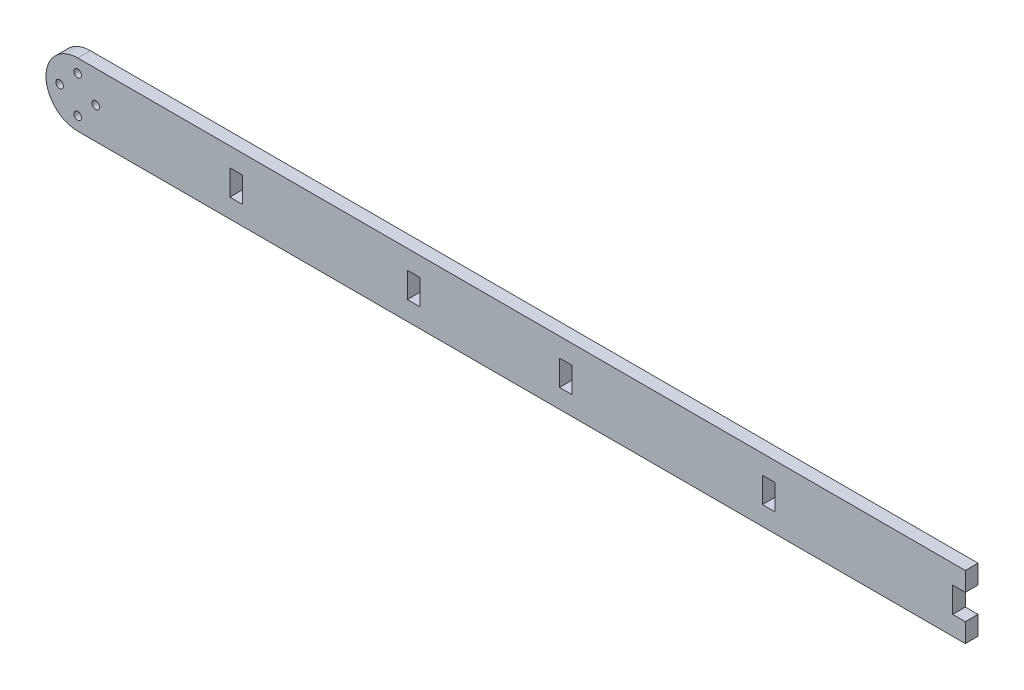
ISO-10303-21;
HEADER;
FILE_DESCRIPTION(('STEP AP214'),'2;1');
FILE_NAME('part.step','',(''),(''),'','','');
FILE_SCHEMA(('AUTOMOTIVE_DESIGN { 1 0 10303 214 1 1 1 1 }'));
ENDSEC;
DATA;
#1=APPLICATION_CONTEXT('core data for automotive mechanical design processes');
#2=APPLICATION_PROTOCOL_DEFINITION('international standard','automotive_design',2000,#1);
#3=PRODUCT_CONTEXT('',#1,'mechanical');
#4=PRODUCT('Part','Part','',(#3));
#5=PRODUCT_RELATED_PRODUCT_CATEGORY('part','',(#4));
#6=PRODUCT_DEFINITION_FORMATION('','',#4);
#7=PRODUCT_DEFINITION_CONTEXT('part definition',#1,'design');
#8=PRODUCT_DEFINITION('design','',#6,#7);
#9=PRODUCT_DEFINITION_SHAPE('','',#8);
#10=(LENGTH_UNIT() NAMED_UNIT(*) SI_UNIT(.MILLI.,.METRE.));
#11=(NAMED_UNIT(*) PLANE_ANGLE_UNIT() SI_UNIT($,.RADIAN.));
#12=(NAMED_UNIT(*) SI_UNIT($,.STERADIAN.) SOLID_ANGLE_UNIT());
#13=UNCERTAINTY_MEASURE_WITH_UNIT(LENGTH_MEASURE(1.E-05),#10,'distance_accuracy_value','');
#14=(GEOMETRIC_REPRESENTATION_CONTEXT(3) GLOBAL_UNCERTAINTY_ASSIGNED_CONTEXT((#13)) GLOBAL_UNIT_ASSIGNED_CONTEXT((#10,
#11,#12)) REPRESENTATION_CONTEXT('',''));
#15=CARTESIAN_POINT('',(0.,0.,0.));
#16=DIRECTION('',(0.,0.,1.));
#17=DIRECTION('',(1.,0.,0.));
#18=AXIS2_PLACEMENT_3D('',#15,#16,#17);
#19=CARTESIAN_POINT('',(0.,0.,5.));
#20=DIRECTION('',(0.,0.,1.));
#21=DIRECTION('',(1.,0.,0.));
#22=AXIS2_PLACEMENT_3D('',#19,#20,#21);
#23=PLANE('',#22);
#24=DIRECTION('',(1.,0.,0.));
#25=VECTOR('',#24,1.);
#26=CARTESIAN_POINT('',(270.,5.,5.));
#27=LINE('',#26,#25);
#28=CARTESIAN_POINT('',(270.,5.,5.));
#29=VERTEX_POINT('',#28);
#30=CARTESIAN_POINT('',(275.,5.,5.));
#31=VERTEX_POINT('',#30);
#32=EDGE_CURVE('E204',#29,#31,#27,.T.);
#33=ORIENTED_EDGE('',*,*,#32,.T.);
#34=DIRECTION('',(0.,-1.,0.));
#35=VECTOR('',#34,1.);
#36=CARTESIAN_POINT('',(275.,5.,5.));
#37=LINE('',#36,#35);
#38=CARTESIAN_POINT('',(275.,-5.,5.));
#39=VERTEX_POINT('',#38);
#40=EDGE_CURVE('E216',#31,#39,#37,.T.);
#41=ORIENTED_EDGE('',*,*,#40,.T.);
#42=DIRECTION('',(-1.,0.,0.));
#43=VECTOR('',#42,1.);
#44=CARTESIAN_POINT('',(270.,-5.,5.));
#45=LINE('',#44,#43);
#46=CARTESIAN_POINT('',(270.,-5.,5.));
#47=VERTEX_POINT('',#46);
#48=EDGE_CURVE('E54',#39,#47,#45,.T.);
#49=ORIENTED_EDGE('',*,*,#48,.T.);
#50=DIRECTION('',(0.,1.,0.));
#51=VECTOR('',#50,1.);
#52=CARTESIAN_POINT('',(270.,5.,5.));
#53=LINE('',#52,#51);
#54=EDGE_CURVE('E213',#47,#29,#53,.T.);
#55=ORIENTED_EDGE('',*,*,#54,.T.);
#56=EDGE_LOOP('',(#33,#41,#49,#55));
#57=FACE_BOUND('',#56,.T.);
#58=DIRECTION('',(1.,0.,0.));
#59=VECTOR('',#58,1.);
#60=CARTESIAN_POINT('',(190.,5.,5.));
#61=LINE('',#60,#59);
#62=CARTESIAN_POINT('',(190.,5.,5.));
#63=VERTEX_POINT('',#62);
#64=CARTESIAN_POINT('',(195.,5.,5.));
#65=VERTEX_POINT('',#64);
#66=EDGE_CURVE('E253',#63,#65,#61,.T.);
#67=ORIENTED_EDGE('',*,*,#66,.T.);
#68=DIRECTION('',(0.,-1.,0.));
#69=VECTOR('',#68,1.);
#70=CARTESIAN_POINT('',(195.,5.,5.));
#71=LINE('',#70,#69);
#72=CARTESIAN_POINT('',(195.,-5.,5.));
#73=VERTEX_POINT('',#72);
#74=EDGE_CURVE('E257',#65,#73,#71,.T.);
#75=ORIENTED_EDGE('',*,*,#74,.T.);
#76=DIRECTION('',(-1.,0.,0.));
#77=VECTOR('',#76,1.);
#78=CARTESIAN_POINT('',(190.,-5.,5.));
#79=LINE('',#78,#77);
#80=CARTESIAN_POINT('',(190.,-5.,5.));
#81=VERTEX_POINT('',#80);
#82=EDGE_CURVE('E62',#73,#81,#79,.T.);
#83=ORIENTED_EDGE('',*,*,#82,.T.);
#84=DIRECTION('',(0.,1.,0.));
#85=VECTOR('',#84,1.);
#86=CARTESIAN_POINT('',(190.,5.,5.));
#87=LINE('',#86,#85);
#88=EDGE_CURVE('E264',#81,#63,#87,.T.);
#89=ORIENTED_EDGE('',*,*,#88,.T.);
#90=EDGE_LOOP('',(#67,#75,#83,#89));
#91=FACE_BOUND('',#90,.T.);
#92=DIRECTION('',(-1.,0.,0.));
#93=VECTOR('',#92,1.);
#94=CARTESIAN_POINT('',(135.,-5.,5.));
#95=LINE('',#94,#93);
#96=CARTESIAN_POINT('',(135.,-5.,5.));
#97=VERTEX_POINT('',#96);
#98=CARTESIAN_POINT('',(130.,-4.99999999999999,5.));
#99=VERTEX_POINT('',#98);
#100=EDGE_CURVE('E295',#97,#99,#95,.T.);
#101=ORIENTED_EDGE('',*,*,#100,.T.);
#102=DIRECTION('',(0.,1.,0.));
#103=VECTOR('',#102,1.);
#104=CARTESIAN_POINT('',(130.,-4.99999999999999,5.));
#105=LINE('',#104,#103);
#106=CARTESIAN_POINT('',(130.,5.,5.));
#107=VERTEX_POINT('',#106);
#108=EDGE_CURVE('E299',#99,#107,#105,.T.);
#109=ORIENTED_EDGE('',*,*,#108,.T.);
#110=DIRECTION('',(1.,0.,0.));
#111=VECTOR('',#110,1.);
#112=CARTESIAN_POINT('',(130.,5.,5.));
#113=LINE('',#112,#111);
#114=CARTESIAN_POINT('',(135.,5.,5.));
#115=VERTEX_POINT('',#114);
#116=EDGE_CURVE('E304',#107,#115,#113,.T.);
#117=ORIENTED_EDGE('',*,*,#116,.T.);
#118=DIRECTION('',(0.,-1.,0.));
#119=VECTOR('',#118,1.);
#120=CARTESIAN_POINT('',(135.,5.,5.));
#121=LINE('',#120,#119);
#122=EDGE_CURVE('E308',#115,#97,#121,.T.);
#123=ORIENTED_EDGE('',*,*,#122,.T.);
#124=EDGE_LOOP('',(#101,#109,#117,#123));
#125=FACE_BOUND('',#124,.T.);
#126=DIRECTION('',(-1.,0.,0.));
#127=VECTOR('',#126,1.);
#128=CARTESIAN_POINT('',(64.9999999999999,-4.99999999999999,5.));
#129=LINE('',#128,#127);
#130=CARTESIAN_POINT('',(64.9999999999999,-4.99999999999999,5.));
#131=VERTEX_POINT('',#130);
#132=CARTESIAN_POINT('',(60.,-4.99999999999999,5.));
#133=VERTEX_POINT('',#132);
#134=EDGE_CURVE('E339',#131,#133,#129,.T.);
#135=ORIENTED_EDGE('',*,*,#134,.T.);
#136=DIRECTION('',(0.,1.,0.));
#137=VECTOR('',#136,1.);
#138=CARTESIAN_POINT('',(60.,-4.99999999999999,5.));
#139=LINE('',#138,#137);
#140=CARTESIAN_POINT('',(60.,5.,5.));
#141=VERTEX_POINT('',#140);
#142=EDGE_CURVE('E343',#133,#141,#139,.T.);
#143=ORIENTED_EDGE('',*,*,#142,.T.);
#144=DIRECTION('',(1.,0.,0.));
#145=VECTOR('',#144,1.);
#146=CARTESIAN_POINT('',(60.,5.,5.));
#147=LINE('',#146,#145);
#148=CARTESIAN_POINT('',(64.9999999999999,5.,5.));
#149=VERTEX_POINT('',#148);
#150=EDGE_CURVE('E348',#141,#149,#147,.T.);
#151=ORIENTED_EDGE('',*,*,#150,.T.);
#152=DIRECTION('',(0.,-1.,0.));
#153=VECTOR('',#152,1.);
#154=CARTESIAN_POINT('',(64.9999999999999,5.,5.));
#155=LINE('',#154,#153);
#156=EDGE_CURVE('E352',#149,#131,#155,.T.);
#157=ORIENTED_EDGE('',*,*,#156,.T.);
#158=EDGE_LOOP('',(#135,#143,#151,#157));
#159=FACE_BOUND('',#158,.T.);
#160=CARTESIAN_POINT('',(0.,7.25,5.));
#161=DIRECTION('',(0.,0.,1.));
#162=DIRECTION('',(1.,0.,0.));
#163=AXIS2_PLACEMENT_3D('',#160,#161,#162);
#164=CIRCLE('',#163,1.5);
#165=CARTESIAN_POINT('',(1.5,7.25,5.));
#166=VERTEX_POINT('',#165);
#167=EDGE_CURVE('E390',#166,#166,#164,.T.);
#168=ORIENTED_EDGE('',*,*,#167,.F.);
#169=EDGE_LOOP('',(#168));
#170=FACE_BOUND('',#169,.T.);
#171=CARTESIAN_POINT('',(-7.11625711772029,0.,5.));
#172=DIRECTION('',(0.,0.,1.));
#173=DIRECTION('',(1.,0.,0.));
#174=AXIS2_PLACEMENT_3D('',#171,#172,#173);
#175=CIRCLE('',#174,1.5);
#176=CARTESIAN_POINT('',(-5.61625711772029,0.,5.));
#177=VERTEX_POINT('',#176);
#178=EDGE_CURVE('E406',#177,#177,#175,.T.);
#179=ORIENTED_EDGE('',*,*,#178,.F.);
#180=EDGE_LOOP('',(#179));
#181=FACE_BOUND('',#180,.T.);
#182=CARTESIAN_POINT('',(0.,0.,5.));
#183=DIRECTION('',(0.,0.,1.));
#184=DIRECTION('',(1.,0.,0.));
#185=AXIS2_PLACEMENT_3D('',#182,#183,#184);
#186=CIRCLE('',#185,12.5);
#187=CARTESIAN_POINT('',(0.,12.5,5.));
#188=VERTEX_POINT('',#187);
#189=CARTESIAN_POINT('',(0.,-12.5,5.));
#190=VERTEX_POINT('',#189);
#191=EDGE_CURVE('E414',#188,#190,#186,.T.);
#192=ORIENTED_EDGE('',*,*,#191,.T.);
#193=DIRECTION('',(1.,0.,0.));
#194=VECTOR('',#193,1.);
#195=CARTESIAN_POINT('',(0.,-12.5,5.));
#196=LINE('',#195,#194);
#197=CARTESIAN_POINT('',(350.,-12.5,5.));
#198=VERTEX_POINT('',#197);
#199=EDGE_CURVE('E418',#190,#198,#196,.T.);
#200=ORIENTED_EDGE('',*,*,#199,.T.);
#201=DIRECTION('',(0.,1.,0.));
#202=VECTOR('',#201,1.);
#203=CARTESIAN_POINT('',(350.,-5.,5.));
#204=LINE('',#203,#202);
#205=CARTESIAN_POINT('',(350.,-5.,5.));
#206=VERTEX_POINT('',#205);
#207=EDGE_CURVE('E422',#198,#206,#204,.T.);
#208=ORIENTED_EDGE('',*,*,#207,.T.);
#209=DIRECTION('',(-1.,0.,0.));
#210=VECTOR('',#209,1.);
#211=CARTESIAN_POINT('',(345.,-5.,5.));
#212=LINE('',#211,#210);
#213=CARTESIAN_POINT('',(345.,-5.,5.));
#214=VERTEX_POINT('',#213);
#215=EDGE_CURVE('E425',#206,#214,#212,.T.);
#216=ORIENTED_EDGE('',*,*,#215,.T.);
#217=DIRECTION('',(0.,1.,0.));
#218=VECTOR('',#217,1.);
#219=CARTESIAN_POINT('',(345.,5.,5.));
#220=LINE('',#219,#218);
#221=CARTESIAN_POINT('',(345.,5.,5.));
#222=VERTEX_POINT('',#221);
#223=EDGE_CURVE('E428',#214,#222,#220,.T.);
#224=ORIENTED_EDGE('',*,*,#223,.T.);
#225=DIRECTION('',(1.,0.,0.));
#226=VECTOR('',#225,1.);
#227=CARTESIAN_POINT('',(345.,5.,5.));
#228=LINE('',#227,#226);
#229=CARTESIAN_POINT('',(350.,5.,5.));
#230=VERTEX_POINT('',#229);
#231=EDGE_CURVE('E431',#222,#230,#228,.T.);
#232=ORIENTED_EDGE('',*,*,#231,.T.);
#233=DIRECTION('',(0.,1.,0.));
#234=VECTOR('',#233,1.);
#235=CARTESIAN_POINT('',(350.,12.5,5.));
#236=LINE('',#235,#234);
#237=CARTESIAN_POINT('',(350.,12.5,5.));
#238=VERTEX_POINT('',#237);
#239=EDGE_CURVE('E434',#230,#238,#236,.T.);
#240=ORIENTED_EDGE('',*,*,#239,.T.);
#241=DIRECTION('',(-1.,0.,0.));
#242=VECTOR('',#241,1.);
#243=CARTESIAN_POINT('',(0.,12.5,5.));
#244=LINE('',#243,#242);
#245=EDGE_CURVE('E437',#238,#188,#244,.T.);
#246=ORIENTED_EDGE('',*,*,#245,.T.);
#247=EDGE_LOOP('',(#192,#200,#208,#216,#224,#232,#240,#246));
#248=FACE_BOUND('',#247,.T.);
#249=CARTESIAN_POINT('',(7.11625711772029,0.,5.));
#250=DIRECTION('',(0.,0.,1.));
#251=DIRECTION('',(1.,0.,0.));
#252=AXIS2_PLACEMENT_3D('',#249,#250,#251);
#253=CIRCLE('',#252,1.5);
#254=CARTESIAN_POINT('',(8.61625711772029,0.,5.));
#255=VERTEX_POINT('',#254);
#256=EDGE_CURVE('E398',#255,#255,#253,.T.);
#257=ORIENTED_EDGE('',*,*,#256,.F.);
#258=EDGE_LOOP('',(#257));
#259=FACE_BOUND('',#258,.T.);
#260=CARTESIAN_POINT('',(0.,-7.25,5.));
#261=DIRECTION('',(0.,0.,1.));
#262=DIRECTION('',(1.,0.,0.));
#263=AXIS2_PLACEMENT_3D('',#260,#261,#262);
#264=CIRCLE('',#263,1.5);
#265=CARTESIAN_POINT('',(1.5,-7.25,5.));
#266=VERTEX_POINT('',#265);
#267=EDGE_CURVE('E382',#266,#266,#264,.T.);
#268=ORIENTED_EDGE('',*,*,#267,.F.);
#269=EDGE_LOOP('',(#268));
#270=FACE_BOUND('',#269,.T.);
#271=ADVANCED_FACE('F38',(#57,#91,#125,#159,#170,#181,#248,#259,#270),#23,.T.);
#272=CARTESIAN_POINT('',(0.,0.,0.));
#273=DIRECTION('',(0.,0.,1.));
#274=DIRECTION('',(1.,0.,0.));
#275=AXIS2_PLACEMENT_3D('',#272,#273,#274);
#276=PLANE('',#275);
#277=DIRECTION('',(0.,-1.,0.));
#278=VECTOR('',#277,1.);
#279=CARTESIAN_POINT('',(275.,5.,0.));
#280=LINE('',#279,#278);
#281=CARTESIAN_POINT('',(275.,5.,0.));
#282=VERTEX_POINT('',#281);
#283=CARTESIAN_POINT('',(275.,-5.,0.));
#284=VERTEX_POINT('',#283);
#285=EDGE_CURVE('E237',#282,#284,#280,.T.);
#286=ORIENTED_EDGE('',*,*,#285,.F.);
#287=DIRECTION('',(1.,0.,0.));
#288=VECTOR('',#287,1.);
#289=CARTESIAN_POINT('',(270.,5.,0.));
#290=LINE('',#289,#288);
#291=CARTESIAN_POINT('',(270.,5.,0.));
#292=VERTEX_POINT('',#291);
#293=EDGE_CURVE('E207',#292,#282,#290,.T.);
#294=ORIENTED_EDGE('',*,*,#293,.F.);
#295=DIRECTION('',(0.,1.,0.));
#296=VECTOR('',#295,1.);
#297=CARTESIAN_POINT('',(270.,5.,0.));
#298=LINE('',#297,#296);
#299=CARTESIAN_POINT('',(270.,-5.,0.));
#300=VERTEX_POINT('',#299);
#301=EDGE_CURVE('E224',#300,#292,#298,.T.);
#302=ORIENTED_EDGE('',*,*,#301,.F.);
#303=DIRECTION('',(-1.,0.,0.));
#304=VECTOR('',#303,1.);
#305=CARTESIAN_POINT('',(270.,-5.,0.));
#306=LINE('',#305,#304);
#307=EDGE_CURVE('E228',#284,#300,#306,.T.);
#308=ORIENTED_EDGE('',*,*,#307,.F.);
#309=EDGE_LOOP('',(#286,#294,#302,#308));
#310=FACE_BOUND('',#309,.T.);
#311=DIRECTION('',(0.,-1.,0.));
#312=VECTOR('',#311,1.);
#313=CARTESIAN_POINT('',(195.,5.,0.));
#314=LINE('',#313,#312);
#315=CARTESIAN_POINT('',(195.,5.,0.));
#316=VERTEX_POINT('',#315);
#317=CARTESIAN_POINT('',(195.,-5.,0.));
#318=VERTEX_POINT('',#317);
#319=EDGE_CURVE('E272',#316,#318,#314,.T.);
#320=ORIENTED_EDGE('',*,*,#319,.F.);
#321=DIRECTION('',(1.,0.,0.));
#322=VECTOR('',#321,1.);
#323=CARTESIAN_POINT('',(190.,5.,0.));
#324=LINE('',#323,#322);
#325=CARTESIAN_POINT('',(190.,5.,0.));
#326=VERTEX_POINT('',#325);
#327=EDGE_CURVE('E269',#326,#316,#324,.T.);
#328=ORIENTED_EDGE('',*,*,#327,.F.);
#329=DIRECTION('',(0.,1.,0.));
#330=VECTOR('',#329,1.);
#331=CARTESIAN_POINT('',(190.,5.,0.));
#332=LINE('',#331,#330);
#333=CARTESIAN_POINT('',(190.,-5.,0.));
#334=VERTEX_POINT('',#333);
#335=EDGE_CURVE('E258',#334,#326,#332,.T.);
#336=ORIENTED_EDGE('',*,*,#335,.F.);
#337=DIRECTION('',(-1.,0.,0.));
#338=VECTOR('',#337,1.);
#339=CARTESIAN_POINT('',(190.,-5.,0.));
#340=LINE('',#339,#338);
#341=EDGE_CURVE('E277',#318,#334,#340,.T.);
#342=ORIENTED_EDGE('',*,*,#341,.F.);
#343=EDGE_LOOP('',(#320,#328,#336,#342));
#344=FACE_BOUND('',#343,.T.);
#345=DIRECTION('',(0.,1.,0.));
#346=VECTOR('',#345,1.);
#347=CARTESIAN_POINT('',(130.,-4.99999999999999,0.));
#348=LINE('',#347,#346);
#349=CARTESIAN_POINT('',(130.,-4.99999999999999,0.));
#350=VERTEX_POINT('',#349);
#351=CARTESIAN_POINT('',(130.,5.,0.));
#352=VERTEX_POINT('',#351);
#353=EDGE_CURVE('E316',#350,#352,#348,.T.);
#354=ORIENTED_EDGE('',*,*,#353,.F.);
#355=DIRECTION('',(-1.,0.,0.));
#356=VECTOR('',#355,1.);
#357=CARTESIAN_POINT('',(135.,-5.,0.));
#358=LINE('',#357,#356);
#359=CARTESIAN_POINT('',(135.,-5.,0.));
#360=VERTEX_POINT('',#359);
#361=EDGE_CURVE('E313',#360,#350,#358,.T.);
#362=ORIENTED_EDGE('',*,*,#361,.F.);
#363=DIRECTION('',(0.,-1.,0.));
#364=VECTOR('',#363,1.);
#365=CARTESIAN_POINT('',(135.,5.,0.));
#366=LINE('',#365,#364);
#367=CARTESIAN_POINT('',(135.,5.,0.));
#368=VERTEX_POINT('',#367);
#369=EDGE_CURVE('E300',#368,#360,#366,.T.);
#370=ORIENTED_EDGE('',*,*,#369,.F.);
#371=DIRECTION('',(1.,0.,0.));
#372=VECTOR('',#371,1.);
#373=CARTESIAN_POINT('',(130.,5.,0.));
#374=LINE('',#373,#372);
#375=EDGE_CURVE('E321',#352,#368,#374,.T.);
#376=ORIENTED_EDGE('',*,*,#375,.F.);
#377=EDGE_LOOP('',(#354,#362,#370,#376));
#378=FACE_BOUND('',#377,.T.);
#379=DIRECTION('',(0.,1.,0.));
#380=VECTOR('',#379,1.);
#381=CARTESIAN_POINT('',(60.,-4.99999999999999,0.));
#382=LINE('',#381,#380);
#383=CARTESIAN_POINT('',(60.,-4.99999999999999,0.));
#384=VERTEX_POINT('',#383);
#385=CARTESIAN_POINT('',(60.,5.,0.));
#386=VERTEX_POINT('',#385);
#387=EDGE_CURVE('E360',#384,#386,#382,.T.);
#388=ORIENTED_EDGE('',*,*,#387,.F.);
#389=DIRECTION('',(-1.,0.,0.));
#390=VECTOR('',#389,1.);
#391=CARTESIAN_POINT('',(64.9999999999999,-4.99999999999999,0.));
#392=LINE('',#391,#390);
#393=CARTESIAN_POINT('',(64.9999999999999,-4.99999999999999,0.));
#394=VERTEX_POINT('',#393);
#395=EDGE_CURVE('E357',#394,#384,#392,.T.);
#396=ORIENTED_EDGE('',*,*,#395,.F.);
#397=DIRECTION('',(0.,-1.,0.));
#398=VECTOR('',#397,1.);
#399=CARTESIAN_POINT('',(64.9999999999999,5.,0.));
#400=LINE('',#399,#398);
#401=CARTESIAN_POINT('',(64.9999999999999,5.,0.));
#402=VERTEX_POINT('',#401);
#403=EDGE_CURVE('E344',#402,#394,#400,.T.);
#404=ORIENTED_EDGE('',*,*,#403,.F.);
#405=DIRECTION('',(1.,0.,0.));
#406=VECTOR('',#405,1.);
#407=CARTESIAN_POINT('',(60.,5.,0.));
#408=LINE('',#407,#406);
#409=EDGE_CURVE('E364',#386,#402,#408,.T.);
#410=ORIENTED_EDGE('',*,*,#409,.F.);
#411=EDGE_LOOP('',(#388,#396,#404,#410));
#412=FACE_BOUND('',#411,.T.);
#413=CARTESIAN_POINT('',(0.,0.,0.));
#414=DIRECTION('',(0.,0.,1.));
#415=DIRECTION('',(1.,0.,0.));
#416=AXIS2_PLACEMENT_3D('',#413,#414,#415);
#417=CIRCLE('',#416,12.5);
#418=CARTESIAN_POINT('',(0.,12.5,0.));
#419=VERTEX_POINT('',#418);
#420=CARTESIAN_POINT('',(0.,-12.5,0.));
#421=VERTEX_POINT('',#420);
#422=EDGE_CURVE('E410',#419,#421,#417,.T.);
#423=ORIENTED_EDGE('',*,*,#422,.F.);
#424=DIRECTION('',(-1.,0.,0.));
#425=VECTOR('',#424,1.);
#426=CARTESIAN_POINT('',(0.,12.5,0.));
#427=LINE('',#426,#425);
#428=CARTESIAN_POINT('',(350.,12.5,0.));
#429=VERTEX_POINT('',#428);
#430=EDGE_CURVE('E419',#429,#419,#427,.T.);
#431=ORIENTED_EDGE('',*,*,#430,.F.);
#432=DIRECTION('',(0.,1.,0.));
#433=VECTOR('',#432,1.);
#434=CARTESIAN_POINT('',(350.,12.5,0.));
#435=LINE('',#434,#433);
#436=CARTESIAN_POINT('',(350.,5.,0.));
#437=VERTEX_POINT('',#436);
#438=EDGE_CURVE('E459',#437,#429,#435,.T.);
#439=ORIENTED_EDGE('',*,*,#438,.F.);
#440=DIRECTION('',(1.,0.,0.));
#441=VECTOR('',#440,1.);
#442=CARTESIAN_POINT('',(345.,5.,0.));
#443=LINE('',#442,#441);
#444=CARTESIAN_POINT('',(345.,5.,0.));
#445=VERTEX_POINT('',#444);
#446=EDGE_CURVE('E456',#445,#437,#443,.T.);
#447=ORIENTED_EDGE('',*,*,#446,.F.);
#448=DIRECTION('',(0.,1.,0.));
#449=VECTOR('',#448,1.);
#450=CARTESIAN_POINT('',(345.,5.,0.));
#451=LINE('',#450,#449);
#452=CARTESIAN_POINT('',(345.,-5.,0.));
#453=VERTEX_POINT('',#452);
#454=EDGE_CURVE('E453',#453,#445,#451,.T.);
#455=ORIENTED_EDGE('',*,*,#454,.F.);
#456=DIRECTION('',(-1.,0.,0.));
#457=VECTOR('',#456,1.);
#458=CARTESIAN_POINT('',(345.,-5.,0.));
#459=LINE('',#458,#457);
#460=CARTESIAN_POINT('',(350.,-5.,0.));
#461=VERTEX_POINT('',#460);
#462=EDGE_CURVE('E450',#461,#453,#459,.T.);
#463=ORIENTED_EDGE('',*,*,#462,.F.);
#464=DIRECTION('',(0.,1.,0.));
#465=VECTOR('',#464,1.);
#466=CARTESIAN_POINT('',(350.,-5.,0.));
#467=LINE('',#466,#465);
#468=CARTESIAN_POINT('',(350.,-12.5,0.));
#469=VERTEX_POINT('',#468);
#470=EDGE_CURVE('E447',#469,#461,#467,.T.);
#471=ORIENTED_EDGE('',*,*,#470,.F.);
#472=DIRECTION('',(1.,0.,0.));
#473=VECTOR('',#472,1.);
#474=CARTESIAN_POINT('',(0.,-12.5,0.));
#475=LINE('',#474,#473);
#476=EDGE_CURVE('E444',#421,#469,#475,.T.);
#477=ORIENTED_EDGE('',*,*,#476,.F.);
#478=EDGE_LOOP('',(#423,#431,#439,#447,#455,#463,#471,#477));
#479=FACE_BOUND('',#478,.T.);
#480=CARTESIAN_POINT('',(-7.11625711772029,0.,0.));
#481=DIRECTION('',(0.,0.,1.));
#482=DIRECTION('',(1.,0.,0.));
#483=AXIS2_PLACEMENT_3D('',#480,#481,#482);
#484=CIRCLE('',#483,1.5);
#485=CARTESIAN_POINT('',(-5.61625711772029,0.,0.));
#486=VERTEX_POINT('',#485);
#487=EDGE_CURVE('E402',#486,#486,#484,.T.);
#488=ORIENTED_EDGE('',*,*,#487,.T.);
#489=EDGE_LOOP('',(#488));
#490=FACE_BOUND('',#489,.T.);
#491=CARTESIAN_POINT('',(7.11625711772029,0.,0.));
#492=DIRECTION('',(0.,0.,1.));
#493=DIRECTION('',(1.,0.,0.));
#494=AXIS2_PLACEMENT_3D('',#491,#492,#493);
#495=CIRCLE('',#494,1.5);
#496=CARTESIAN_POINT('',(8.61625711772029,0.,0.));
#497=VERTEX_POINT('',#496);
#498=EDGE_CURVE('E394',#497,#497,#495,.T.);
#499=ORIENTED_EDGE('',*,*,#498,.T.);
#500=EDGE_LOOP('',(#499));
#501=FACE_BOUND('',#500,.T.);
#502=CARTESIAN_POINT('',(0.,7.25,0.));
#503=DIRECTION('',(0.,0.,1.));
#504=DIRECTION('',(1.,0.,0.));
#505=AXIS2_PLACEMENT_3D('',#502,#503,#504);
#506=CIRCLE('',#505,1.5);
#507=CARTESIAN_POINT('',(1.5,7.25,0.));
#508=VERTEX_POINT('',#507);
#509=EDGE_CURVE('E386',#508,#508,#506,.T.);
#510=ORIENTED_EDGE('',*,*,#509,.T.);
#511=EDGE_LOOP('',(#510));
#512=FACE_BOUND('',#511,.T.);
#513=CARTESIAN_POINT('',(0.,-7.25,0.));
#514=DIRECTION('',(0.,0.,1.));
#515=DIRECTION('',(1.,0.,0.));
#516=AXIS2_PLACEMENT_3D('',#513,#514,#515);
#517=CIRCLE('',#516,1.5);
#518=CARTESIAN_POINT('',(1.5,-7.25,0.));
#519=VERTEX_POINT('',#518);
#520=EDGE_CURVE('E247',#519,#519,#517,.T.);
#521=ORIENTED_EDGE('',*,*,#520,.T.);
#522=EDGE_LOOP('',(#521));
#523=FACE_BOUND('',#522,.T.);
#524=ADVANCED_FACE('F498',(#310,#344,#378,#412,#479,#490,#501,#512,#523),#276,.F.);
#525=CARTESIAN_POINT('',(0.,0.,5.));
#526=DIRECTION('',(0.,0.,-1.));
#527=DIRECTION('',(-1.,0.,0.));
#528=AXIS2_PLACEMENT_3D('',#525,#526,#527);
#529=CYLINDRICAL_SURFACE('',#528,12.5);
#530=ORIENTED_EDGE('',*,*,#422,.T.);
#531=DIRECTION('',(0.,0.,-1.));
#532=VECTOR('',#531,1.);
#533=CARTESIAN_POINT('',(0.,-12.5,5.));
#534=LINE('',#533,#532);
#535=EDGE_CURVE('E11',#190,#421,#534,.T.);
#536=ORIENTED_EDGE('',*,*,#535,.F.);
#537=ORIENTED_EDGE('',*,*,#191,.F.);
#538=DIRECTION('',(0.,0.,-1.));
#539=VECTOR('',#538,1.);
#540=CARTESIAN_POINT('',(0.,12.5,5.));
#541=LINE('',#540,#539);
#542=EDGE_CURVE('E440',#188,#419,#541,.T.);
#543=ORIENTED_EDGE('',*,*,#542,.T.);
#544=EDGE_LOOP('',(#530,#536,#537,#543));
#545=FACE_BOUND('',#544,.T.);
#546=ADVANCED_FACE('F40',(#545),#529,.T.);
#547=CARTESIAN_POINT('',(0.,-12.5,5.));
#548=DIRECTION('',(0.,1.,0.));
#549=DIRECTION('',(0.,0.,1.));
#550=AXIS2_PLACEMENT_3D('',#547,#548,#549);
#551=PLANE('',#550);
#552=ORIENTED_EDGE('',*,*,#476,.T.);
#553=DIRECTION('',(0.,0.,-1.));
#554=VECTOR('',#553,1.);
#555=CARTESIAN_POINT('',(350.,-12.5,5.));
#556=LINE('',#555,#554);
#557=EDGE_CURVE('E47',#198,#469,#556,.T.);
#558=ORIENTED_EDGE('',*,*,#557,.F.);
#559=ORIENTED_EDGE('',*,*,#199,.F.);
#560=ORIENTED_EDGE('',*,*,#535,.T.);
#561=EDGE_LOOP('',(#552,#558,#559,#560));
#562=FACE_BOUND('',#561,.T.);
#563=ADVANCED_FACE('F516',(#562),#551,.F.);
#564=CARTESIAN_POINT('',(350.,-5.,5.));
#565=DIRECTION('',(-1.,0.,0.));
#566=DIRECTION('',(0.,0.,1.));
#567=AXIS2_PLACEMENT_3D('',#564,#565,#566);
#568=PLANE('',#567);
#569=ORIENTED_EDGE('',*,*,#470,.T.);
#570=DIRECTION('',(0.,0.,-1.));
#571=VECTOR('',#570,1.);
#572=CARTESIAN_POINT('',(350.,-5.,5.));
#573=LINE('',#572,#571);
#574=EDGE_CURVE('E483',#206,#461,#573,.T.);
#575=ORIENTED_EDGE('',*,*,#574,.F.);
#576=ORIENTED_EDGE('',*,*,#207,.F.);
#577=ORIENTED_EDGE('',*,*,#557,.T.);
#578=EDGE_LOOP('',(#569,#575,#576,#577));
#579=FACE_BOUND('',#578,.T.);
#580=ADVANCED_FACE('F492',(#579),#568,.F.);
#581=CARTESIAN_POINT('',(345.,-5.,5.));
#582=DIRECTION('',(0.,-1.,0.));
#583=DIRECTION('',(0.,0.,-1.));
#584=AXIS2_PLACEMENT_3D('',#581,#582,#583);
#585=PLANE('',#584);
#586=ORIENTED_EDGE('',*,*,#462,.T.);
#587=DIRECTION('',(0.,0.,-1.));
#588=VECTOR('',#587,1.);
#589=CARTESIAN_POINT('',(345.,-5.,5.));
#590=LINE('',#589,#588);
#591=EDGE_CURVE('E479',#214,#453,#590,.T.);
#592=ORIENTED_EDGE('',*,*,#591,.F.);
#593=ORIENTED_EDGE('',*,*,#215,.F.);
#594=ORIENTED_EDGE('',*,*,#574,.T.);
#595=EDGE_LOOP('',(#586,#592,#593,#594));
#596=FACE_BOUND('',#595,.T.);
#597=ADVANCED_FACE('F504',(#596),#585,.F.);
#598=CARTESIAN_POINT('',(345.,5.,5.));
#599=DIRECTION('',(-1.,0.,0.));
#600=DIRECTION('',(0.,0.,1.));
#601=AXIS2_PLACEMENT_3D('',#598,#599,#600);
#602=PLANE('',#601);
#603=ORIENTED_EDGE('',*,*,#454,.T.);
#604=DIRECTION('',(0.,0.,-1.));
#605=VECTOR('',#604,1.);
#606=CARTESIAN_POINT('',(345.,5.,5.));
#607=LINE('',#606,#605);
#608=EDGE_CURVE('E475',#222,#445,#607,.T.);
#609=ORIENTED_EDGE('',*,*,#608,.F.);
#610=ORIENTED_EDGE('',*,*,#223,.F.);
#611=ORIENTED_EDGE('',*,*,#591,.T.);
#612=EDGE_LOOP('',(#603,#609,#610,#611));
#613=FACE_BOUND('',#612,.T.);
#614=ADVANCED_FACE('F508',(#613),#602,.F.);
#615=CARTESIAN_POINT('',(345.,5.,5.));
#616=DIRECTION('',(0.,1.,0.));
#617=DIRECTION('',(0.,0.,1.));
#618=AXIS2_PLACEMENT_3D('',#615,#616,#617);
#619=PLANE('',#618);
#620=ORIENTED_EDGE('',*,*,#446,.T.);
#621=DIRECTION('',(0.,0.,-1.));
#622=VECTOR('',#621,1.);
#623=CARTESIAN_POINT('',(350.,5.,5.));
#624=LINE('',#623,#622);
#625=EDGE_CURVE('E471',#230,#437,#624,.T.);
#626=ORIENTED_EDGE('',*,*,#625,.F.);
#627=ORIENTED_EDGE('',*,*,#231,.F.);
#628=ORIENTED_EDGE('',*,*,#608,.T.);
#629=EDGE_LOOP('',(#620,#626,#627,#628));
#630=FACE_BOUND('',#629,.T.);
#631=ADVANCED_FACE('F529',(#630),#619,.F.);
#632=CARTESIAN_POINT('',(350.,12.5,5.));
#633=DIRECTION('',(-1.,0.,0.));
#634=DIRECTION('',(0.,0.,1.));
#635=AXIS2_PLACEMENT_3D('',#632,#633,#634);
#636=PLANE('',#635);
#637=ORIENTED_EDGE('',*,*,#438,.T.);
#638=DIRECTION('',(0.,0.,-1.));
#639=VECTOR('',#638,1.);
#640=CARTESIAN_POINT('',(350.,12.5,5.));
#641=LINE('',#640,#639);
#642=EDGE_CURVE('E467',#238,#429,#641,.T.);
#643=ORIENTED_EDGE('',*,*,#642,.F.);
#644=ORIENTED_EDGE('',*,*,#239,.F.);
#645=ORIENTED_EDGE('',*,*,#625,.T.);
#646=EDGE_LOOP('',(#637,#643,#644,#645));
#647=FACE_BOUND('',#646,.T.);
#648=ADVANCED_FACE('F527',(#647),#636,.F.);
#649=CARTESIAN_POINT('',(0.,12.5,5.));
#650=DIRECTION('',(0.,-1.,0.));
#651=DIRECTION('',(0.,0.,-1.));
#652=AXIS2_PLACEMENT_3D('',#649,#650,#651);
#653=PLANE('',#652);
#654=ORIENTED_EDGE('',*,*,#430,.T.);
#655=ORIENTED_EDGE('',*,*,#542,.F.);
#656=ORIENTED_EDGE('',*,*,#245,.F.);
#657=ORIENTED_EDGE('',*,*,#642,.T.);
#658=EDGE_LOOP('',(#654,#655,#656,#657));
#659=FACE_BOUND('',#658,.T.);
#660=ADVANCED_FACE('F522',(#659),#653,.F.);
#661=CARTESIAN_POINT('',(-7.11625711772029,0.,5.));
#662=DIRECTION('',(0.,0.,-1.));
#663=DIRECTION('',(-1.,0.,0.));
#664=AXIS2_PLACEMENT_3D('',#661,#662,#663);
#665=CYLINDRICAL_SURFACE('',#664,1.5);
#666=ORIENTED_EDGE('',*,*,#178,.T.);
#667=EDGE_LOOP('',(#666));
#668=FACE_BOUND('',#667,.T.);
#669=ORIENTED_EDGE('',*,*,#487,.F.);
#670=EDGE_LOOP('',(#669));
#671=FACE_BOUND('',#670,.T.);
#672=ADVANCED_FACE('F547',(#668,#671),#665,.F.);
#673=CARTESIAN_POINT('',(7.11625711772029,0.,5.));
#674=DIRECTION('',(0.,0.,-1.));
#675=DIRECTION('',(-1.,0.,0.));
#676=AXIS2_PLACEMENT_3D('',#673,#674,#675);
#677=CYLINDRICAL_SURFACE('',#676,1.5);
#678=ORIENTED_EDGE('',*,*,#256,.T.);
#679=EDGE_LOOP('',(#678));
#680=FACE_BOUND('',#679,.T.);
#681=ORIENTED_EDGE('',*,*,#498,.F.);
#682=EDGE_LOOP('',(#681));
#683=FACE_BOUND('',#682,.T.);
#684=ADVANCED_FACE('F554',(#680,#683),#677,.F.);
#685=CARTESIAN_POINT('',(0.,7.25,5.));
#686=DIRECTION('',(0.,0.,-1.));
#687=DIRECTION('',(-1.,0.,0.));
#688=AXIS2_PLACEMENT_3D('',#685,#686,#687);
#689=CYLINDRICAL_SURFACE('',#688,1.5);
#690=ORIENTED_EDGE('',*,*,#167,.T.);
#691=EDGE_LOOP('',(#690));
#692=FACE_BOUND('',#691,.T.);
#693=ORIENTED_EDGE('',*,*,#509,.F.);
#694=EDGE_LOOP('',(#693));
#695=FACE_BOUND('',#694,.T.);
#696=ADVANCED_FACE('F559',(#692,#695),#689,.F.);
#697=CARTESIAN_POINT('',(0.,-7.25,5.));
#698=DIRECTION('',(0.,0.,-1.));
#699=DIRECTION('',(-1.,0.,0.));
#700=AXIS2_PLACEMENT_3D('',#697,#698,#699);
#701=CYLINDRICAL_SURFACE('',#700,1.5);
#702=ORIENTED_EDGE('',*,*,#267,.T.);
#703=EDGE_LOOP('',(#702));
#704=FACE_BOUND('',#703,.T.);
#705=ORIENTED_EDGE('',*,*,#520,.F.);
#706=EDGE_LOOP('',(#705));
#707=FACE_BOUND('',#706,.T.);
#708=ADVANCED_FACE('F571',(#704,#707),#701,.F.);
#709=CARTESIAN_POINT('',(64.9999999999999,-4.99999999999999,5.));
#710=DIRECTION('',(0.,-1.,0.));
#711=DIRECTION('',(1.,0.,0.));
#712=AXIS2_PLACEMENT_3D('',#709,#710,#711);
#713=PLANE('',#712);
#714=ORIENTED_EDGE('',*,*,#395,.T.);
#715=DIRECTION('',(0.,0.,-1.));
#716=VECTOR('',#715,1.);
#717=CARTESIAN_POINT('',(60.,-4.99999999999999,5.));
#718=LINE('',#717,#716);
#719=EDGE_CURVE('E356',#133,#384,#718,.T.);
#720=ORIENTED_EDGE('',*,*,#719,.F.);
#721=ORIENTED_EDGE('',*,*,#134,.F.);
#722=DIRECTION('',(0.,0.,-1.));
#723=VECTOR('',#722,1.);
#724=CARTESIAN_POINT('',(64.9999999999999,-4.99999999999999,5.));
#725=LINE('',#724,#723);
#726=EDGE_CURVE('E317',#131,#394,#725,.T.);
#727=ORIENTED_EDGE('',*,*,#726,.T.);
#728=EDGE_LOOP('',(#714,#720,#721,#727));
#729=FACE_BOUND('',#728,.T.);
#730=ADVANCED_FACE('F573',(#729),#713,.F.);
#731=CARTESIAN_POINT('',(64.9999999999999,5.,5.));
#732=DIRECTION('',(1.,0.,0.));
#733=DIRECTION('',(0.,0.,-1.));
#734=AXIS2_PLACEMENT_3D('',#731,#732,#733);
#735=PLANE('',#734);
#736=ORIENTED_EDGE('',*,*,#403,.T.);
#737=ORIENTED_EDGE('',*,*,#726,.F.);
#738=ORIENTED_EDGE('',*,*,#156,.F.);
#739=DIRECTION('',(0.,0.,-1.));
#740=VECTOR('',#739,1.);
#741=CARTESIAN_POINT('',(64.9999999999999,5.,5.));
#742=LINE('',#741,#740);
#743=EDGE_CURVE('E373',#149,#402,#742,.T.);
#744=ORIENTED_EDGE('',*,*,#743,.T.);
#745=EDGE_LOOP('',(#736,#737,#738,#744));
#746=FACE_BOUND('',#745,.T.);
#747=ADVANCED_FACE('F579',(#746),#735,.F.);
#748=CARTESIAN_POINT('',(60.,5.,5.));
#749=DIRECTION('',(0.,1.,0.));
#750=DIRECTION('',(0.,0.,1.));
#751=AXIS2_PLACEMENT_3D('',#748,#749,#750);
#752=PLANE('',#751);
#753=ORIENTED_EDGE('',*,*,#409,.T.);
#754=ORIENTED_EDGE('',*,*,#743,.F.);
#755=ORIENTED_EDGE('',*,*,#150,.F.);
#756=DIRECTION('',(0.,0.,-1.));
#757=VECTOR('',#756,1.);
#758=CARTESIAN_POINT('',(60.,5.,5.));
#759=LINE('',#758,#757);
#760=EDGE_CURVE('E376',#141,#386,#759,.T.);
#761=ORIENTED_EDGE('',*,*,#760,.T.);
#762=EDGE_LOOP('',(#753,#754,#755,#761));
#763=FACE_BOUND('',#762,.T.);
#764=ADVANCED_FACE('F589',(#763),#752,.F.);
#765=CARTESIAN_POINT('',(60.,-4.99999999999999,5.));
#766=DIRECTION('',(-1.,0.,0.));
#767=DIRECTION('',(0.,0.,1.));
#768=AXIS2_PLACEMENT_3D('',#765,#766,#767);
#769=PLANE('',#768);
#770=ORIENTED_EDGE('',*,*,#387,.T.);
#771=ORIENTED_EDGE('',*,*,#760,.F.);
#772=ORIENTED_EDGE('',*,*,#142,.F.);
#773=ORIENTED_EDGE('',*,*,#719,.T.);
#774=EDGE_LOOP('',(#770,#771,#772,#773));
#775=FACE_BOUND('',#774,.T.);
#776=ADVANCED_FACE('F585',(#775),#769,.F.);
#777=CARTESIAN_POINT('',(135.,-5.,5.));
#778=DIRECTION('',(0.,-1.,0.));
#779=DIRECTION('',(1.,0.,0.));
#780=AXIS2_PLACEMENT_3D('',#777,#778,#779);
#781=PLANE('',#780);
#782=ORIENTED_EDGE('',*,*,#361,.T.);
#783=DIRECTION('',(0.,0.,-1.));
#784=VECTOR('',#783,1.);
#785=CARTESIAN_POINT('',(130.,-4.99999999999999,5.));
#786=LINE('',#785,#784);
#787=EDGE_CURVE('E312',#99,#350,#786,.T.);
#788=ORIENTED_EDGE('',*,*,#787,.F.);
#789=ORIENTED_EDGE('',*,*,#100,.F.);
#790=DIRECTION('',(0.,0.,-1.));
#791=VECTOR('',#790,1.);
#792=CARTESIAN_POINT('',(135.,-5.,5.));
#793=LINE('',#792,#791);
#794=EDGE_CURVE('E273',#97,#360,#793,.T.);
#795=ORIENTED_EDGE('',*,*,#794,.T.);
#796=EDGE_LOOP('',(#782,#788,#789,#795));
#797=FACE_BOUND('',#796,.T.);
#798=ADVANCED_FACE('F588',(#797),#781,.F.);
#799=CARTESIAN_POINT('',(135.,5.,5.));
#800=DIRECTION('',(1.,0.,0.));
#801=DIRECTION('',(0.,0.,-1.));
#802=AXIS2_PLACEMENT_3D('',#799,#800,#801);
#803=PLANE('',#802);
#804=ORIENTED_EDGE('',*,*,#369,.T.);
#805=ORIENTED_EDGE('',*,*,#794,.F.);
#806=ORIENTED_EDGE('',*,*,#122,.F.);
#807=DIRECTION('',(0.,0.,-1.));
#808=VECTOR('',#807,1.);
#809=CARTESIAN_POINT('',(135.,5.,5.));
#810=LINE('',#809,#808);
#811=EDGE_CURVE('E330',#115,#368,#810,.T.);
#812=ORIENTED_EDGE('',*,*,#811,.T.);
#813=EDGE_LOOP('',(#804,#805,#806,#812));
#814=FACE_BOUND('',#813,.T.);
#815=ADVANCED_FACE('F599',(#814),#803,.F.);
#816=CARTESIAN_POINT('',(130.,5.,5.));
#817=DIRECTION('',(0.,1.,0.));
#818=DIRECTION('',(0.,0.,1.));
#819=AXIS2_PLACEMENT_3D('',#816,#817,#818);
#820=PLANE('',#819);
#821=ORIENTED_EDGE('',*,*,#375,.T.);
#822=ORIENTED_EDGE('',*,*,#811,.F.);
#823=ORIENTED_EDGE('',*,*,#116,.F.);
#824=DIRECTION('',(0.,0.,-1.));
#825=VECTOR('',#824,1.);
#826=CARTESIAN_POINT('',(130.,5.,5.));
#827=LINE('',#826,#825);
#828=EDGE_CURVE('E333',#107,#352,#827,.T.);
#829=ORIENTED_EDGE('',*,*,#828,.T.);
#830=EDGE_LOOP('',(#821,#822,#823,#829));
#831=FACE_BOUND('',#830,.T.);
#832=ADVANCED_FACE('F605',(#831),#820,.F.);
#833=CARTESIAN_POINT('',(130.,-4.99999999999999,5.));
#834=DIRECTION('',(-1.,0.,0.));
#835=DIRECTION('',(0.,0.,1.));
#836=AXIS2_PLACEMENT_3D('',#833,#834,#835);
#837=PLANE('',#836);
#838=ORIENTED_EDGE('',*,*,#353,.T.);
#839=ORIENTED_EDGE('',*,*,#828,.F.);
#840=ORIENTED_EDGE('',*,*,#108,.F.);
#841=ORIENTED_EDGE('',*,*,#787,.T.);
#842=EDGE_LOOP('',(#838,#839,#840,#841));
#843=FACE_BOUND('',#842,.T.);
#844=ADVANCED_FACE('F601',(#843),#837,.F.);
#845=CARTESIAN_POINT('',(190.,5.,5.));
#846=DIRECTION('',(0.,1.,0.));
#847=DIRECTION('',(0.,0.,1.));
#848=AXIS2_PLACEMENT_3D('',#845,#846,#847);
#849=PLANE('',#848);
#850=ORIENTED_EDGE('',*,*,#327,.T.);
#851=DIRECTION('',(0.,0.,-1.));
#852=VECTOR('',#851,1.);
#853=CARTESIAN_POINT('',(195.,5.,5.));
#854=LINE('',#853,#852);
#855=EDGE_CURVE('E268',#65,#316,#854,.T.);
#856=ORIENTED_EDGE('',*,*,#855,.F.);
#857=ORIENTED_EDGE('',*,*,#66,.F.);
#858=DIRECTION('',(0.,0.,-1.));
#859=VECTOR('',#858,1.);
#860=CARTESIAN_POINT('',(190.,5.,5.));
#861=LINE('',#860,#859);
#862=EDGE_CURVE('E238',#63,#326,#861,.T.);
#863=ORIENTED_EDGE('',*,*,#862,.T.);
#864=EDGE_LOOP('',(#850,#856,#857,#863));
#865=FACE_BOUND('',#864,.T.);
#866=ADVANCED_FACE('F604',(#865),#849,.F.);
#867=CARTESIAN_POINT('',(190.,5.,5.));
#868=DIRECTION('',(-1.,0.,0.));
#869=DIRECTION('',(0.,0.,1.));
#870=AXIS2_PLACEMENT_3D('',#867,#868,#869);
#871=PLANE('',#870);
#872=ORIENTED_EDGE('',*,*,#335,.T.);
#873=ORIENTED_EDGE('',*,*,#862,.F.);
#874=ORIENTED_EDGE('',*,*,#88,.F.);
#875=DIRECTION('',(0.,0.,-1.));
#876=VECTOR('',#875,1.);
#877=CARTESIAN_POINT('',(190.,-5.,5.));
#878=LINE('',#877,#876);
#879=EDGE_CURVE('E286',#81,#334,#878,.T.);
#880=ORIENTED_EDGE('',*,*,#879,.T.);
#881=EDGE_LOOP('',(#872,#873,#874,#880));
#882=FACE_BOUND('',#881,.T.);
#883=ADVANCED_FACE('F615',(#882),#871,.F.);
#884=CARTESIAN_POINT('',(190.,-5.,5.));
#885=DIRECTION('',(0.,-1.,0.));
#886=DIRECTION('',(1.,0.,0.));
#887=AXIS2_PLACEMENT_3D('',#884,#885,#886);
#888=PLANE('',#887);
#889=ORIENTED_EDGE('',*,*,#341,.T.);
#890=ORIENTED_EDGE('',*,*,#879,.F.);
#891=ORIENTED_EDGE('',*,*,#82,.F.);
#892=DIRECTION('',(0.,0.,-1.));
#893=VECTOR('',#892,1.);
#894=CARTESIAN_POINT('',(195.,-5.,5.));
#895=LINE('',#894,#893);
#896=EDGE_CURVE('E289',#73,#318,#895,.T.);
#897=ORIENTED_EDGE('',*,*,#896,.T.);
#898=EDGE_LOOP('',(#889,#890,#891,#897));
#899=FACE_BOUND('',#898,.T.);
#900=ADVANCED_FACE('F620',(#899),#888,.F.);
#901=CARTESIAN_POINT('',(195.,5.,5.));
#902=DIRECTION('',(1.,0.,0.));
#903=DIRECTION('',(0.,0.,-1.));
#904=AXIS2_PLACEMENT_3D('',#901,#902,#903);
#905=PLANE('',#904);
#906=ORIENTED_EDGE('',*,*,#319,.T.);
#907=ORIENTED_EDGE('',*,*,#896,.F.);
#908=ORIENTED_EDGE('',*,*,#74,.F.);
#909=ORIENTED_EDGE('',*,*,#855,.T.);
#910=EDGE_LOOP('',(#906,#907,#908,#909));
#911=FACE_BOUND('',#910,.T.);
#912=ADVANCED_FACE('F617',(#911),#905,.F.);
#913=CARTESIAN_POINT('',(270.,5.,5.));
#914=DIRECTION('',(0.,1.,0.));
#915=DIRECTION('',(0.,0.,1.));
#916=AXIS2_PLACEMENT_3D('',#913,#914,#915);
#917=PLANE('',#916);
#918=ORIENTED_EDGE('',*,*,#293,.T.);
#919=DIRECTION('',(0.,0.,-1.));
#920=VECTOR('',#919,1.);
#921=CARTESIAN_POINT('',(275.,5.,5.));
#922=LINE('',#921,#920);
#923=EDGE_CURVE('E200',#31,#282,#922,.T.);
#924=ORIENTED_EDGE('',*,*,#923,.F.);
#925=ORIENTED_EDGE('',*,*,#32,.F.);
#926=DIRECTION('',(0.,0.,-1.));
#927=VECTOR('',#926,1.);
#928=CARTESIAN_POINT('',(270.,5.,5.));
#929=LINE('',#928,#927);
#930=EDGE_CURVE('E244',#29,#292,#929,.T.);
#931=ORIENTED_EDGE('',*,*,#930,.T.);
#932=EDGE_LOOP('',(#918,#924,#925,#931));
#933=FACE_BOUND('',#932,.T.);
#934=ADVANCED_FACE('F202',(#933),#917,.F.);
#935=CARTESIAN_POINT('',(270.,5.,5.));
#936=DIRECTION('',(-1.,0.,0.));
#937=DIRECTION('',(0.,0.,1.));
#938=AXIS2_PLACEMENT_3D('',#935,#936,#937);
#939=PLANE('',#938);
#940=ORIENTED_EDGE('',*,*,#301,.T.);
#941=ORIENTED_EDGE('',*,*,#930,.F.);
#942=ORIENTED_EDGE('',*,*,#54,.F.);
#943=DIRECTION('',(0.,0.,-1.));
#944=VECTOR('',#943,1.);
#945=CARTESIAN_POINT('',(270.,-5.,5.));
#946=LINE('',#945,#944);
#947=EDGE_CURVE('E248',#47,#300,#946,.T.);
#948=ORIENTED_EDGE('',*,*,#947,.T.);
#949=EDGE_LOOP('',(#940,#941,#942,#948));
#950=FACE_BOUND('',#949,.T.);
#951=ADVANCED_FACE('F629',(#950),#939,.F.);
#952=CARTESIAN_POINT('',(270.,-5.,5.));
#953=DIRECTION('',(0.,-1.,0.));
#954=DIRECTION('',(1.,0.,0.));
#955=AXIS2_PLACEMENT_3D('',#952,#953,#954);
#956=PLANE('',#955);
#957=ORIENTED_EDGE('',*,*,#307,.T.);
#958=ORIENTED_EDGE('',*,*,#947,.F.);
#959=ORIENTED_EDGE('',*,*,#48,.F.);
#960=DIRECTION('',(0.,0.,-1.));
#961=VECTOR('',#960,1.);
#962=CARTESIAN_POINT('',(275.,-5.,5.));
#963=LINE('',#962,#961);
#964=EDGE_CURVE('E212',#39,#284,#963,.T.);
#965=ORIENTED_EDGE('',*,*,#964,.T.);
#966=EDGE_LOOP('',(#957,#958,#959,#965));
#967=FACE_BOUND('',#966,.T.);
#968=ADVANCED_FACE('F632',(#967),#956,.F.);
#969=CARTESIAN_POINT('',(275.,5.,5.));
#970=DIRECTION('',(1.,0.,0.));
#971=DIRECTION('',(0.,0.,-1.));
#972=AXIS2_PLACEMENT_3D('',#969,#970,#971);
#973=PLANE('',#972);
#974=ORIENTED_EDGE('',*,*,#285,.T.);
#975=ORIENTED_EDGE('',*,*,#964,.F.);
#976=ORIENTED_EDGE('',*,*,#40,.F.);
#977=ORIENTED_EDGE('',*,*,#923,.T.);
#978=EDGE_LOOP('',(#974,#975,#976,#977));
#979=FACE_BOUND('',#978,.T.);
#980=ADVANCED_FACE('F217',(#979),#973,.F.);
#981=CLOSED_SHELL('',(#271,#524,#546,#563,#580,#597,#614,#631,#648,#660,#672,#684,#696,#708,
#730,#747,#764,#776,#798,#815,#832,#844,#866,#883,#900,#912,#934,#951,#968,#980));
#982=MANIFOLD_SOLID_BREP('B2',#981);
#983=ADVANCED_BREP_SHAPE_REPRESENTATION('',(#18,#982),#14);
#984=SHAPE_DEFINITION_REPRESENTATION(#9,#983);
ENDSEC;
END-ISO-10303-21;
